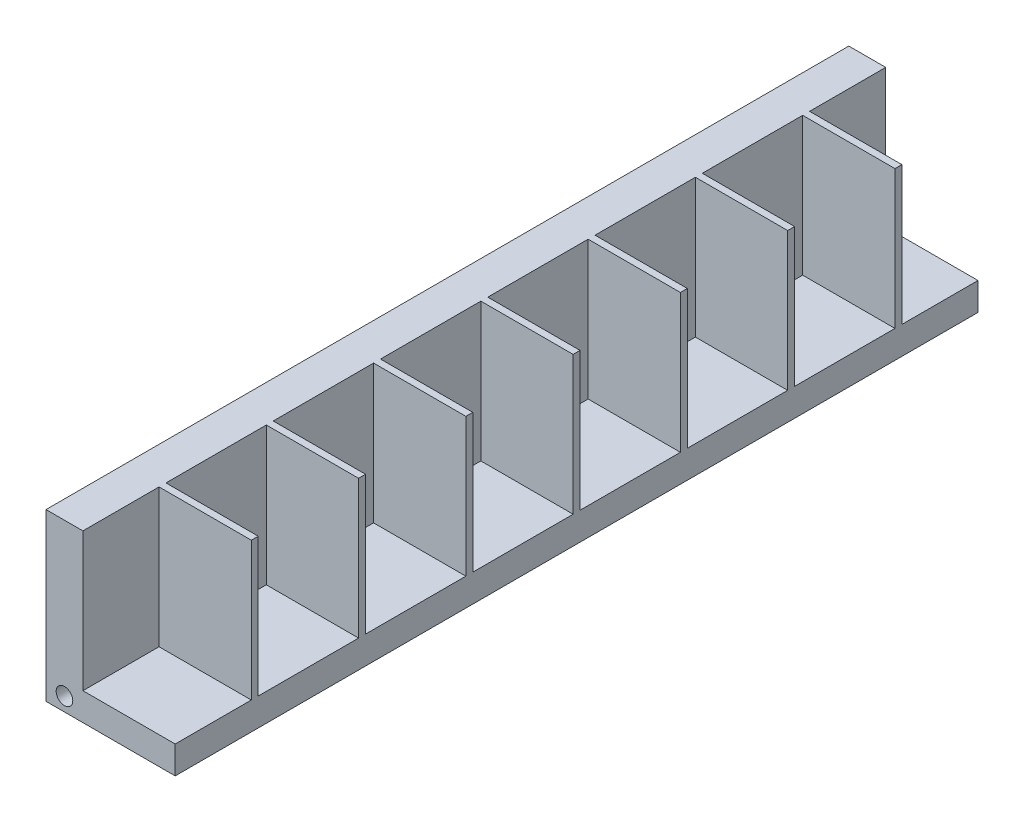
ISO-10303-21;
HEADER;
FILE_DESCRIPTION(('STEP AP214'),'2;1');
FILE_NAME('part.step','',(''),(''),'','','');
FILE_SCHEMA(('AUTOMOTIVE_DESIGN { 1 0 10303 214 1 1 1 1 }'));
ENDSEC;
DATA;
#1=APPLICATION_CONTEXT('core data for automotive mechanical design processes');
#2=APPLICATION_PROTOCOL_DEFINITION('international standard','automotive_design',2000,#1);
#3=PRODUCT_CONTEXT('',#1,'mechanical');
#4=PRODUCT('Part','Part','',(#3));
#5=PRODUCT_RELATED_PRODUCT_CATEGORY('part','',(#4));
#6=PRODUCT_DEFINITION_FORMATION('','',#4);
#7=PRODUCT_DEFINITION_CONTEXT('part definition',#1,'design');
#8=PRODUCT_DEFINITION('design','',#6,#7);
#9=PRODUCT_DEFINITION_SHAPE('','',#8);
#10=(LENGTH_UNIT() NAMED_UNIT(*) SI_UNIT(.MILLI.,.METRE.));
#11=(NAMED_UNIT(*) PLANE_ANGLE_UNIT() SI_UNIT($,.RADIAN.));
#12=(NAMED_UNIT(*) SI_UNIT($,.STERADIAN.) SOLID_ANGLE_UNIT());
#13=UNCERTAINTY_MEASURE_WITH_UNIT(LENGTH_MEASURE(1.E-05),#10,'distance_accuracy_value','');
#14=(GEOMETRIC_REPRESENTATION_CONTEXT(3) GLOBAL_UNCERTAINTY_ASSIGNED_CONTEXT((#13)) GLOBAL_UNIT_ASSIGNED_CONTEXT((#10,
#11,#12)) REPRESENTATION_CONTEXT('',''));
#15=CARTESIAN_POINT('',(0.,0.,0.));
#16=DIRECTION('',(0.,0.,1.));
#17=DIRECTION('',(1.,0.,0.));
#18=AXIS2_PLACEMENT_3D('',#15,#16,#17);
#19=CARTESIAN_POINT('',(-28.,-6.,-184.));
#20=DIRECTION('',(0.,-1.,0.));
#21=DIRECTION('',(0.,0.,-1.));
#22=AXIS2_PLACEMENT_3D('',#19,#20,#21);
#23=PLANE('',#22);
#24=DIRECTION('',(0.,0.,1.));
#25=VECTOR('',#24,1.);
#26=CARTESIAN_POINT('',(-28.,-6.,-184.));
#27=LINE('',#26,#25);
#28=CARTESIAN_POINT('',(-28.,-6.,-179.));
#29=VERTEX_POINT('',#28);
#30=CARTESIAN_POINT('',(-28.,-6.,-5.));
#31=VERTEX_POINT('',#30);
#32=EDGE_CURVE('E11',#29,#31,#27,.T.);
#33=ORIENTED_EDGE('',*,*,#32,.F.);
#34=DIRECTION('',(-1.,0.,0.));
#35=VECTOR('',#34,1.);
#36=CARTESIAN_POINT('',(-28.,-6.,-179.));
#37=LINE('',#36,#35);
#38=CARTESIAN_POINT('',(-4.82420696955816E-13,-6.,-179.));
#39=VERTEX_POINT('',#38);
#40=EDGE_CURVE('E264',#39,#29,#37,.T.);
#41=ORIENTED_EDGE('',*,*,#40,.F.);
#42=DIRECTION('',(0.,0.,1.));
#43=VECTOR('',#42,1.);
#44=CARTESIAN_POINT('',(0.,-6.,-184.));
#45=LINE('',#44,#43);
#46=CARTESIAN_POINT('',(0.,-6.,-5.));
#47=VERTEX_POINT('',#46);
#48=EDGE_CURVE('E292',#39,#47,#45,.T.);
#49=ORIENTED_EDGE('',*,*,#48,.T.);
#50=DIRECTION('',(1.,0.,0.));
#51=VECTOR('',#50,1.);
#52=CARTESIAN_POINT('',(-28.,-6.,-5.));
#53=LINE('',#52,#51);
#54=EDGE_CURVE('E303',#31,#47,#53,.T.);
#55=ORIENTED_EDGE('',*,*,#54,.F.);
#56=EDGE_LOOP('',(#33,#41,#49,#55));
#57=FACE_BOUND('',#56,.T.);
#58=ADVANCED_FACE('F39',(#57),#23,.T.);
#59=CARTESIAN_POINT('',(-28.,30.,-184.));
#60=DIRECTION('',(-1.,0.,0.));
#61=DIRECTION('',(0.,-1.,0.));
#62=AXIS2_PLACEMENT_3D('',#59,#60,#61);
#63=PLANE('',#62);
#64=DIRECTION('',(0.,0.,1.));
#65=VECTOR('',#64,1.);
#66=CARTESIAN_POINT('',(-28.,30.,-184.));
#67=LINE('',#66,#65);
#68=CARTESIAN_POINT('',(-28.,30.,-179.));
#69=VERTEX_POINT('',#68);
#70=CARTESIAN_POINT('',(-28.,30.,-5.));
#71=VERTEX_POINT('',#70);
#72=EDGE_CURVE('E47',#69,#71,#67,.T.);
#73=ORIENTED_EDGE('',*,*,#72,.F.);
#74=DIRECTION('',(0.,1.,0.));
#75=VECTOR('',#74,1.);
#76=CARTESIAN_POINT('',(-28.,-6.,-179.));
#77=LINE('',#76,#75);
#78=EDGE_CURVE('E259',#29,#69,#77,.T.);
#79=ORIENTED_EDGE('',*,*,#78,.F.);
#80=ORIENTED_EDGE('',*,*,#32,.T.);
#81=DIRECTION('',(0.,-1.,0.));
#82=VECTOR('',#81,1.);
#83=CARTESIAN_POINT('',(-28.,30.,-5.));
#84=LINE('',#83,#82);
#85=EDGE_CURVE('E281',#71,#31,#84,.T.);
#86=ORIENTED_EDGE('',*,*,#85,.F.);
#87=EDGE_LOOP('',(#73,#79,#80,#86));
#88=FACE_BOUND('',#87,.T.);
#89=ADVANCED_FACE('F279',(#88),#63,.T.);
#90=CARTESIAN_POINT('',(0.,30.,-184.));
#91=DIRECTION('',(0.,1.,0.));
#92=DIRECTION('',(-1.,0.,0.));
#93=AXIS2_PLACEMENT_3D('',#90,#91,#92);
#94=PLANE('',#93);
#95=DIRECTION('',(0.,0.,1.));
#96=VECTOR('',#95,1.);
#97=CARTESIAN_POINT('',(-20.0000000000006,30.,-162.75));
#98=LINE('',#97,#96);
#99=CARTESIAN_POINT('',(-20.0000000000006,30.,-179.));
#100=VERTEX_POINT('',#99);
#101=CARTESIAN_POINT('',(-20.0000000000005,30.,-162.5));
#102=VERTEX_POINT('',#101);
#103=EDGE_CURVE('E275',#100,#102,#98,.T.);
#104=ORIENTED_EDGE('',*,*,#103,.F.);
#105=DIRECTION('',(1.,0.,0.));
#106=VECTOR('',#105,1.);
#107=CARTESIAN_POINT('',(-28.,30.,-179.));
#108=LINE('',#107,#106);
#109=EDGE_CURVE('E262',#69,#100,#108,.T.);
#110=ORIENTED_EDGE('',*,*,#109,.F.);
#111=ORIENTED_EDGE('',*,*,#72,.T.);
#112=DIRECTION('',(-1.,0.,0.));
#113=VECTOR('',#112,1.);
#114=CARTESIAN_POINT('',(-28.,30.,-5.));
#115=LINE('',#114,#113);
#116=CARTESIAN_POINT('',(-20.,30.,-5.));
#117=VERTEX_POINT('',#116);
#118=EDGE_CURVE('E297',#117,#71,#115,.T.);
#119=ORIENTED_EDGE('',*,*,#118,.F.);
#120=DIRECTION('',(0.,0.,1.));
#121=VECTOR('',#120,1.);
#122=CARTESIAN_POINT('',(-20.,30.,0.));
#123=LINE('',#122,#121);
#124=CARTESIAN_POINT('',(-20.,30.,-21.5));
#125=VERTEX_POINT('',#124);
#126=EDGE_CURVE('E471',#125,#117,#123,.T.);
#127=ORIENTED_EDGE('',*,*,#126,.F.);
#128=DIRECTION('',(-1.,0.,0.));
#129=VECTOR('',#128,1.);
#130=CARTESIAN_POINT('',(-20.,30.,-21.5));
#131=LINE('',#130,#129);
#132=CARTESIAN_POINT('',(0.,30.,-21.5));
#133=VERTEX_POINT('',#132);
#134=EDGE_CURVE('E319',#133,#125,#131,.T.);
#135=ORIENTED_EDGE('',*,*,#134,.F.);
#136=DIRECTION('',(0.,0.,1.));
#137=VECTOR('',#136,1.);
#138=CARTESIAN_POINT('',(0.,30.,-184.));
#139=LINE('',#138,#137);
#140=CARTESIAN_POINT('',(0.,30.,-23.));
#141=VERTEX_POINT('',#140);
#142=EDGE_CURVE('E287',#141,#133,#139,.T.);
#143=ORIENTED_EDGE('',*,*,#142,.F.);
#144=DIRECTION('',(1.,0.,0.));
#145=VECTOR('',#144,1.);
#146=CARTESIAN_POINT('',(-20.,30.,-23.));
#147=LINE('',#146,#145);
#148=CARTESIAN_POINT('',(-20.,30.,-23.));
#149=VERTEX_POINT('',#148);
#150=EDGE_CURVE('E322',#149,#141,#147,.T.);
#151=ORIENTED_EDGE('',*,*,#150,.F.);
#152=DIRECTION('',(0.,0.,1.));
#153=VECTOR('',#152,1.);
#154=CARTESIAN_POINT('',(-20.0000000000001,30.,-23.25));
#155=LINE('',#154,#153);
#156=CARTESIAN_POINT('',(-20.0000000000001,30.,-44.75));
#157=VERTEX_POINT('',#156);
#158=EDGE_CURVE('E476',#157,#149,#155,.T.);
#159=ORIENTED_EDGE('',*,*,#158,.F.);
#160=DIRECTION('',(-1.,0.,0.));
#161=VECTOR('',#160,1.);
#162=CARTESIAN_POINT('',(-20.0000000000001,30.,-44.75));
#163=LINE('',#162,#161);
#164=CARTESIAN_POINT('',(0.,30.,-44.75));
#165=VERTEX_POINT('',#164);
#166=EDGE_CURVE('E335',#165,#157,#163,.T.);
#167=ORIENTED_EDGE('',*,*,#166,.F.);
#168=CARTESIAN_POINT('',(0.,30.,-46.25));
#169=VERTEX_POINT('',#168);
#170=EDGE_CURVE('E291',#169,#165,#139,.T.);
#171=ORIENTED_EDGE('',*,*,#170,.F.);
#172=DIRECTION('',(1.,0.,0.));
#173=VECTOR('',#172,1.);
#174=CARTESIAN_POINT('',(-20.0000000000001,30.,-46.25));
#175=LINE('',#174,#173);
#176=CARTESIAN_POINT('',(-20.0000000000001,30.,-46.25));
#177=VERTEX_POINT('',#176);
#178=EDGE_CURVE('E345',#177,#169,#175,.T.);
#179=ORIENTED_EDGE('',*,*,#178,.F.);
#180=DIRECTION('',(0.,0.,1.));
#181=VECTOR('',#180,1.);
#182=CARTESIAN_POINT('',(-20.0000000000002,30.,-46.5));
#183=LINE('',#182,#181);
#184=CARTESIAN_POINT('',(-20.0000000000002,30.,-68.));
#185=VERTEX_POINT('',#184);
#186=EDGE_CURVE('E481',#185,#177,#183,.T.);
#187=ORIENTED_EDGE('',*,*,#186,.F.);
#188=DIRECTION('',(-1.,0.,0.));
#189=VECTOR('',#188,1.);
#190=CARTESIAN_POINT('',(-20.0000000000002,30.,-68.));
#191=LINE('',#190,#189);
#192=CARTESIAN_POINT('',(-1.63223843039567E-13,30.,-68.));
#193=VERTEX_POINT('',#192);
#194=EDGE_CURVE('E357',#193,#185,#191,.T.);
#195=ORIENTED_EDGE('',*,*,#194,.F.);
#196=CARTESIAN_POINT('',(-1.63407540059439E-13,30.,-69.5));
#197=VERTEX_POINT('',#196);
#198=EDGE_CURVE('E553',#197,#193,#139,.T.);
#199=ORIENTED_EDGE('',*,*,#198,.F.);
#200=DIRECTION('',(1.,0.,0.));
#201=VECTOR('',#200,1.);
#202=CARTESIAN_POINT('',(-20.0000000000002,30.,-69.5));
#203=LINE('',#202,#201);
#204=CARTESIAN_POINT('',(-20.0000000000002,30.,-69.5));
#205=VERTEX_POINT('',#204);
#206=EDGE_CURVE('E367',#205,#197,#203,.T.);
#207=ORIENTED_EDGE('',*,*,#206,.F.);
#208=DIRECTION('',(0.,0.,1.));
#209=VECTOR('',#208,1.);
#210=CARTESIAN_POINT('',(-20.0000000000002,30.,-69.75));
#211=LINE('',#210,#209);
#212=CARTESIAN_POINT('',(-20.0000000000002,30.,-91.25));
#213=VERTEX_POINT('',#212);
#214=EDGE_CURVE('E487',#213,#205,#211,.T.);
#215=ORIENTED_EDGE('',*,*,#214,.F.);
#216=DIRECTION('',(-1.,0.,0.));
#217=VECTOR('',#216,1.);
#218=CARTESIAN_POINT('',(-20.0000000000002,30.,-91.25));
#219=LINE('',#218,#217);
#220=CARTESIAN_POINT('',(-2.42977132263661E-13,30.,-91.25));
#221=VERTEX_POINT('',#220);
#222=EDGE_CURVE('E379',#221,#213,#219,.T.);
#223=ORIENTED_EDGE('',*,*,#222,.F.);
#224=CARTESIAN_POINT('',(-2.43160829283533E-13,30.,-92.75));
#225=VERTEX_POINT('',#224);
#226=EDGE_CURVE('E549',#225,#221,#139,.T.);
#227=ORIENTED_EDGE('',*,*,#226,.F.);
#228=DIRECTION('',(1.,0.,0.));
#229=VECTOR('',#228,1.);
#230=CARTESIAN_POINT('',(-20.0000000000002,30.,-92.75));
#231=LINE('',#230,#229);
#232=CARTESIAN_POINT('',(-20.0000000000002,30.,-92.75));
#233=VERTEX_POINT('',#232);
#234=EDGE_CURVE('E389',#233,#225,#231,.T.);
#235=ORIENTED_EDGE('',*,*,#234,.F.);
#236=DIRECTION('',(0.,0.,1.));
#237=VECTOR('',#236,1.);
#238=CARTESIAN_POINT('',(-20.0000000000003,30.,-93.));
#239=LINE('',#238,#237);
#240=CARTESIAN_POINT('',(-20.0000000000003,30.,-114.5));
#241=VERTEX_POINT('',#240);
#242=EDGE_CURVE('E493',#241,#233,#239,.T.);
#243=ORIENTED_EDGE('',*,*,#242,.F.);
#244=DIRECTION('',(-1.,0.,0.));
#245=VECTOR('',#244,1.);
#246=CARTESIAN_POINT('',(-20.0000000000003,30.,-114.5));
#247=LINE('',#246,#245);
#248=CARTESIAN_POINT('',(-3.22730421487755E-13,30.,-114.5));
#249=VERTEX_POINT('',#248);
#250=EDGE_CURVE('E401',#249,#241,#247,.T.);
#251=ORIENTED_EDGE('',*,*,#250,.F.);
#252=CARTESIAN_POINT('',(-3.22914118507627E-13,30.,-116.));
#253=VERTEX_POINT('',#252);
#254=EDGE_CURVE('E547',#253,#249,#139,.T.);
#255=ORIENTED_EDGE('',*,*,#254,.F.);
#256=DIRECTION('',(1.,0.,0.));
#257=VECTOR('',#256,1.);
#258=CARTESIAN_POINT('',(-20.0000000000003,30.,-116.));
#259=LINE('',#258,#257);
#260=CARTESIAN_POINT('',(-20.0000000000003,30.,-116.));
#261=VERTEX_POINT('',#260);
#262=EDGE_CURVE('E411',#261,#253,#259,.T.);
#263=ORIENTED_EDGE('',*,*,#262,.F.);
#264=DIRECTION('',(0.,0.,1.));
#265=VECTOR('',#264,1.);
#266=CARTESIAN_POINT('',(-20.0000000000004,30.,-116.25));
#267=LINE('',#266,#265);
#268=CARTESIAN_POINT('',(-20.0000000000004,30.,-137.75));
#269=VERTEX_POINT('',#268);
#270=EDGE_CURVE('E499',#269,#261,#267,.T.);
#271=ORIENTED_EDGE('',*,*,#270,.F.);
#272=DIRECTION('',(-1.,0.,0.));
#273=VECTOR('',#272,1.);
#274=CARTESIAN_POINT('',(-20.0000000000004,30.,-137.75));
#275=LINE('',#274,#273);
#276=CARTESIAN_POINT('',(-4.02483710711849E-13,30.,-137.75));
#277=VERTEX_POINT('',#276);
#278=EDGE_CURVE('E423',#277,#269,#275,.T.);
#279=ORIENTED_EDGE('',*,*,#278,.F.);
#280=CARTESIAN_POINT('',(-4.02667407731721E-13,30.,-139.25));
#281=VERTEX_POINT('',#280);
#282=EDGE_CURVE('E285',#281,#277,#139,.T.);
#283=ORIENTED_EDGE('',*,*,#282,.F.);
#284=DIRECTION('',(1.,0.,0.));
#285=VECTOR('',#284,1.);
#286=CARTESIAN_POINT('',(-20.0000000000004,30.,-139.25));
#287=LINE('',#286,#285);
#288=CARTESIAN_POINT('',(-20.0000000000004,30.,-139.25));
#289=VERTEX_POINT('',#288);
#290=EDGE_CURVE('E433',#289,#281,#287,.T.);
#291=ORIENTED_EDGE('',*,*,#290,.F.);
#292=DIRECTION('',(0.,0.,1.));
#293=VECTOR('',#292,1.);
#294=CARTESIAN_POINT('',(-20.0000000000005,30.,-139.5));
#295=LINE('',#294,#293);
#296=CARTESIAN_POINT('',(-20.0000000000005,30.,-161.));
#297=VERTEX_POINT('',#296);
#298=EDGE_CURVE('E505',#297,#289,#295,.T.);
#299=ORIENTED_EDGE('',*,*,#298,.F.);
#300=DIRECTION('',(-1.,0.,0.));
#301=VECTOR('',#300,1.);
#302=CARTESIAN_POINT('',(-20.0000000000005,30.,-161.));
#303=LINE('',#302,#301);
#304=CARTESIAN_POINT('',(-4.82236999935943E-13,30.,-161.));
#305=VERTEX_POINT('',#304);
#306=EDGE_CURVE('E445',#305,#297,#303,.T.);
#307=ORIENTED_EDGE('',*,*,#306,.F.);
#308=CARTESIAN_POINT('',(-4.82420696955816E-13,30.,-162.5));
#309=VERTEX_POINT('',#308);
#310=EDGE_CURVE('E282',#309,#305,#139,.T.);
#311=ORIENTED_EDGE('',*,*,#310,.F.);
#312=DIRECTION('',(1.,0.,0.));
#313=VECTOR('',#312,1.);
#314=CARTESIAN_POINT('',(-20.0000000000005,30.,-162.5));
#315=LINE('',#314,#313);
#316=EDGE_CURVE('E455',#102,#309,#315,.T.);
#317=ORIENTED_EDGE('',*,*,#316,.F.);
#318=EDGE_LOOP('',(#104,#110,#111,#119,#127,#135,#143,#151,#159,#167,#171,#179,#187,#195,#199,
#207,#215,#223,#227,#235,#243,#251,#255,#263,#271,#279,#283,#291,#299,#307,#311,#317));
#319=FACE_BOUND('',#318,.T.);
#320=ADVANCED_FACE('F271',(#319),#94,.T.);
#321=CARTESIAN_POINT('',(0.,0.,-184.));
#322=DIRECTION('',(1.,0.,0.));
#323=DIRECTION('',(0.,0.,-1.));
#324=AXIS2_PLACEMENT_3D('',#321,#322,#323);
#325=PLANE('',#324);
#326=ORIENTED_EDGE('',*,*,#48,.F.);
#327=DIRECTION('',(0.,-1.,0.));
#328=VECTOR('',#327,1.);
#329=CARTESIAN_POINT('',(-4.82420696955816E-13,-6.,-179.));
#330=LINE('',#329,#328);
#331=CARTESIAN_POINT('',(-4.82420696955816E-13,0.,-179.));
#332=VERTEX_POINT('',#331);
#333=EDGE_CURVE('E276',#332,#39,#330,.T.);
#334=ORIENTED_EDGE('',*,*,#333,.F.);
#335=DIRECTION('',(0.,0.,-1.));
#336=VECTOR('',#335,1.);
#337=CARTESIAN_POINT('',(-5.62298223855911E-13,0.,-162.75));
#338=LINE('',#337,#336);
#339=CARTESIAN_POINT('',(-4.82420696955816E-13,0.,-162.5));
#340=VERTEX_POINT('',#339);
#341=EDGE_CURVE('E513',#340,#332,#338,.T.);
#342=ORIENTED_EDGE('',*,*,#341,.F.);
#343=DIRECTION('',(0.,1.,0.));
#344=VECTOR('',#343,1.);
#345=CARTESIAN_POINT('',(-4.82420696955816E-13,0.,-162.5));
#346=LINE('',#345,#344);
#347=EDGE_CURVE('E314',#340,#309,#346,.T.);
#348=ORIENTED_EDGE('',*,*,#347,.T.);
#349=ORIENTED_EDGE('',*,*,#310,.T.);
#350=DIRECTION('',(0.,1.,0.));
#351=VECTOR('',#350,1.);
#352=CARTESIAN_POINT('',(-4.82236999935943E-13,0.,-161.));
#353=LINE('',#352,#351);
#354=CARTESIAN_POINT('',(-4.82236999935943E-13,0.,-161.));
#355=VERTEX_POINT('',#354);
#356=EDGE_CURVE('E449',#355,#305,#353,.T.);
#357=ORIENTED_EDGE('',*,*,#356,.F.);
#358=DIRECTION('',(0.,0.,-1.));
#359=VECTOR('',#358,1.);
#360=CARTESIAN_POINT('',(-4.82500943960978E-13,0.,-139.5));
#361=LINE('',#360,#359);
#362=CARTESIAN_POINT('',(-4.02667407731721E-13,0.,-139.25));
#363=VERTEX_POINT('',#362);
#364=EDGE_CURVE('E508',#363,#355,#361,.T.);
#365=ORIENTED_EDGE('',*,*,#364,.F.);
#366=DIRECTION('',(0.,1.,0.));
#367=VECTOR('',#366,1.);
#368=CARTESIAN_POINT('',(-4.02667407731721E-13,0.,-139.25));
#369=LINE('',#368,#367);
#370=EDGE_CURVE('E442',#363,#281,#369,.T.);
#371=ORIENTED_EDGE('',*,*,#370,.T.);
#372=ORIENTED_EDGE('',*,*,#282,.T.);
#373=DIRECTION('',(0.,1.,0.));
#374=VECTOR('',#373,1.);
#375=CARTESIAN_POINT('',(-4.02483710711849E-13,0.,-137.75));
#376=LINE('',#375,#374);
#377=CARTESIAN_POINT('',(-4.02483710711849E-13,0.,-137.75));
#378=VERTEX_POINT('',#377);
#379=EDGE_CURVE('E427',#378,#277,#376,.T.);
#380=ORIENTED_EDGE('',*,*,#379,.F.);
#381=DIRECTION('',(0.,0.,-1.));
#382=VECTOR('',#381,1.);
#383=CARTESIAN_POINT('',(-4.02703664066044E-13,0.,-116.25));
#384=LINE('',#383,#382);
#385=CARTESIAN_POINT('',(-3.22914118507627E-13,0.,-116.));
#386=VERTEX_POINT('',#385);
#387=EDGE_CURVE('E502',#386,#378,#384,.T.);
#388=ORIENTED_EDGE('',*,*,#387,.F.);
#389=DIRECTION('',(0.,1.,0.));
#390=VECTOR('',#389,1.);
#391=CARTESIAN_POINT('',(-3.22914118507627E-13,0.,-116.));
#392=LINE('',#391,#390);
#393=EDGE_CURVE('E420',#386,#253,#392,.T.);
#394=ORIENTED_EDGE('',*,*,#393,.T.);
#395=ORIENTED_EDGE('',*,*,#254,.T.);
#396=DIRECTION('',(0.,1.,0.));
#397=VECTOR('',#396,1.);
#398=CARTESIAN_POINT('',(-3.22730421487755E-13,0.,-114.5));
#399=LINE('',#398,#397);
#400=CARTESIAN_POINT('',(-3.22730421487755E-13,0.,-114.5));
#401=VERTEX_POINT('',#400);
#402=EDGE_CURVE('E405',#401,#249,#399,.T.);
#403=ORIENTED_EDGE('',*,*,#402,.F.);
#404=DIRECTION('',(0.,0.,-1.));
#405=VECTOR('',#404,1.);
#406=CARTESIAN_POINT('',(-3.22906384171111E-13,0.,-93.));
#407=LINE('',#406,#405);
#408=CARTESIAN_POINT('',(-2.43160829283533E-13,0.,-92.75));
#409=VERTEX_POINT('',#408);
#410=EDGE_CURVE('E496',#409,#401,#407,.T.);
#411=ORIENTED_EDGE('',*,*,#410,.F.);
#412=DIRECTION('',(0.,1.,0.));
#413=VECTOR('',#412,1.);
#414=CARTESIAN_POINT('',(-2.43160829283533E-13,0.,-92.75));
#415=LINE('',#414,#413);
#416=EDGE_CURVE('E398',#409,#225,#415,.T.);
#417=ORIENTED_EDGE('',*,*,#416,.T.);
#418=ORIENTED_EDGE('',*,*,#226,.T.);
#419=DIRECTION('',(0.,1.,0.));
#420=VECTOR('',#419,1.);
#421=CARTESIAN_POINT('',(-2.42977132263661E-13,0.,-91.25));
#422=LINE('',#421,#420);
#423=CARTESIAN_POINT('',(-2.42977132263661E-13,0.,-91.25));
#424=VERTEX_POINT('',#423);
#425=EDGE_CURVE('E383',#424,#221,#422,.T.);
#426=ORIENTED_EDGE('',*,*,#425,.F.);
#427=DIRECTION('',(0.,0.,-1.));
#428=VECTOR('',#427,1.);
#429=CARTESIAN_POINT('',(-2.43109104276178E-13,0.,-69.75));
#430=LINE('',#429,#428);
#431=CARTESIAN_POINT('',(-1.63407540059439E-13,0.,-69.5));
#432=VERTEX_POINT('',#431);
#433=EDGE_CURVE('E490',#432,#424,#430,.T.);
#434=ORIENTED_EDGE('',*,*,#433,.F.);
#435=DIRECTION('',(0.,1.,0.));
#436=VECTOR('',#435,1.);
#437=CARTESIAN_POINT('',(-1.63407540059439E-13,0.,-69.5));
#438=LINE('',#437,#436);
#439=EDGE_CURVE('E376',#432,#197,#438,.T.);
#440=ORIENTED_EDGE('',*,*,#439,.T.);
#441=ORIENTED_EDGE('',*,*,#198,.T.);
#442=DIRECTION('',(0.,1.,0.));
#443=VECTOR('',#442,1.);
#444=CARTESIAN_POINT('',(-1.63223843039567E-13,0.,-68.));
#445=LINE('',#444,#443);
#446=CARTESIAN_POINT('',(-1.63223843039567E-13,0.,-68.));
#447=VERTEX_POINT('',#446);
#448=EDGE_CURVE('E361',#447,#193,#445,.T.);
#449=ORIENTED_EDGE('',*,*,#448,.F.);
#450=DIRECTION('',(0.,0.,-1.));
#451=VECTOR('',#450,1.);
#452=CARTESIAN_POINT('',(-1.63311824381245E-13,0.,-46.5));
#453=LINE('',#452,#451);
#454=CARTESIAN_POINT('',(0.,0.,-46.25));
#455=VERTEX_POINT('',#454);
#456=EDGE_CURVE('E484',#455,#447,#453,.T.);
#457=ORIENTED_EDGE('',*,*,#456,.F.);
#458=DIRECTION('',(0.,1.,0.));
#459=VECTOR('',#458,1.);
#460=CARTESIAN_POINT('',(0.,0.,-46.25));
#461=LINE('',#460,#459);
#462=EDGE_CURVE('E354',#455,#169,#461,.T.);
#463=ORIENTED_EDGE('',*,*,#462,.T.);
#464=ORIENTED_EDGE('',*,*,#170,.T.);
#465=DIRECTION('',(0.,1.,0.));
#466=VECTOR('',#465,1.);
#467=CARTESIAN_POINT('',(0.,0.,-44.75));
#468=LINE('',#467,#466);
#469=CARTESIAN_POINT('',(0.,0.,-44.75));
#470=VERTEX_POINT('',#469);
#471=EDGE_CURVE('E339',#470,#165,#468,.T.);
#472=ORIENTED_EDGE('',*,*,#471,.F.);
#473=DIRECTION('',(0.,0.,-1.));
#474=VECTOR('',#473,1.);
#475=CARTESIAN_POINT('',(0.,0.,-23.25));
#476=LINE('',#475,#474);
#477=CARTESIAN_POINT('',(0.,0.,-23.));
#478=VERTEX_POINT('',#477);
#479=EDGE_CURVE('E478',#478,#470,#476,.T.);
#480=ORIENTED_EDGE('',*,*,#479,.F.);
#481=DIRECTION('',(0.,1.,0.));
#482=VECTOR('',#481,1.);
#483=CARTESIAN_POINT('',(0.,0.,-23.));
#484=LINE('',#483,#482);
#485=EDGE_CURVE('E332',#478,#141,#484,.T.);
#486=ORIENTED_EDGE('',*,*,#485,.T.);
#487=ORIENTED_EDGE('',*,*,#142,.T.);
#488=DIRECTION('',(0.,1.,0.));
#489=VECTOR('',#488,1.);
#490=CARTESIAN_POINT('',(0.,0.,-21.5));
#491=LINE('',#490,#489);
#492=CARTESIAN_POINT('',(0.,0.,-21.5));
#493=VERTEX_POINT('',#492);
#494=EDGE_CURVE('E318',#493,#133,#491,.T.);
#495=ORIENTED_EDGE('',*,*,#494,.F.);
#496=DIRECTION('',(0.,0.,-1.));
#497=VECTOR('',#496,1.);
#498=CARTESIAN_POINT('',(0.,0.,0.));
#499=LINE('',#498,#497);
#500=CARTESIAN_POINT('',(0.,0.,-5.));
#501=VERTEX_POINT('',#500);
#502=EDGE_CURVE('E469',#501,#493,#499,.T.);
#503=ORIENTED_EDGE('',*,*,#502,.F.);
#504=DIRECTION('',(0.,1.,0.));
#505=VECTOR('',#504,1.);
#506=CARTESIAN_POINT('',(0.,30.,-5.));
#507=LINE('',#506,#505);
#508=EDGE_CURVE('E63',#47,#501,#507,.T.);
#509=ORIENTED_EDGE('',*,*,#508,.F.);
#510=EDGE_LOOP('',(#326,#334,#342,#348,#349,#357,#365,#371,#372,#380,#388,#394,#395,#403,#411,
#417,#418,#426,#434,#440,#441,#449,#457,#463,#464,#472,#480,#486,#487,#495,#503,#509));
#511=FACE_BOUND('',#510,.T.);
#512=ADVANCED_FACE('F524',(#511),#325,.T.);
#513=CARTESIAN_POINT('',(-20.0000000000006,0.,-162.75));
#514=DIRECTION('',(-1.,0.,0.));
#515=DIRECTION('',(0.,0.,1.));
#516=AXIS2_PLACEMENT_3D('',#513,#514,#515);
#517=PLANE('',#516);
#518=DIRECTION('',(0.,-1.,0.));
#519=VECTOR('',#518,1.);
#520=CARTESIAN_POINT('',(-20.0000000000006,0.,-179.));
#521=LINE('',#520,#519);
#522=CARTESIAN_POINT('',(-20.0000000000006,0.,-179.));
#523=VERTEX_POINT('',#522);
#524=EDGE_CURVE('E55',#100,#523,#521,.T.);
#525=ORIENTED_EDGE('',*,*,#524,.F.);
#526=ORIENTED_EDGE('',*,*,#103,.T.);
#527=DIRECTION('',(0.,1.,0.));
#528=VECTOR('',#527,1.);
#529=CARTESIAN_POINT('',(-20.0000000000005,0.,-162.5));
#530=LINE('',#529,#528);
#531=CARTESIAN_POINT('',(-20.0000000000005,0.,-162.5));
#532=VERTEX_POINT('',#531);
#533=EDGE_CURVE('E460',#532,#102,#530,.T.);
#534=ORIENTED_EDGE('',*,*,#533,.F.);
#535=DIRECTION('',(0.,0.,1.));
#536=VECTOR('',#535,1.);
#537=CARTESIAN_POINT('',(-20.0000000000006,0.,-162.75));
#538=LINE('',#537,#536);
#539=EDGE_CURVE('E326',#523,#532,#538,.T.);
#540=ORIENTED_EDGE('',*,*,#539,.F.);
#541=EDGE_LOOP('',(#525,#526,#534,#540));
#542=FACE_BOUND('',#541,.T.);
#543=ADVANCED_FACE('F600',(#542),#517,.F.);
#544=CARTESIAN_POINT('',(0.,0.,0.));
#545=DIRECTION('',(0.,-1.,0.));
#546=DIRECTION('',(0.,0.,-1.));
#547=AXIS2_PLACEMENT_3D('',#544,#545,#546);
#548=PLANE('',#547);
#549=DIRECTION('',(1.,0.,0.));
#550=VECTOR('',#549,1.);
#551=CARTESIAN_POINT('',(0.,0.,-179.));
#552=LINE('',#551,#550);
#553=EDGE_CURVE('E517',#523,#332,#552,.T.);
#554=ORIENTED_EDGE('',*,*,#553,.F.);
#555=ORIENTED_EDGE('',*,*,#539,.T.);
#556=DIRECTION('',(1.,0.,0.));
#557=VECTOR('',#556,1.);
#558=CARTESIAN_POINT('',(-20.0000000000005,0.,-162.5));
#559=LINE('',#558,#557);
#560=EDGE_CURVE('E463',#532,#340,#559,.T.);
#561=ORIENTED_EDGE('',*,*,#560,.T.);
#562=ORIENTED_EDGE('',*,*,#341,.T.);
#563=EDGE_LOOP('',(#554,#555,#561,#562));
#564=FACE_BOUND('',#563,.T.);
#565=ADVANCED_FACE('F516',(#564),#548,.F.);
#566=CARTESIAN_POINT('',(-20.,0.,0.));
#567=DIRECTION('',(-1.,0.,0.));
#568=DIRECTION('',(0.,0.,1.));
#569=AXIS2_PLACEMENT_3D('',#566,#567,#568);
#570=PLANE('',#569);
#571=DIRECTION('',(0.,1.,0.));
#572=VECTOR('',#571,1.);
#573=CARTESIAN_POINT('',(-20.,0.,-5.));
#574=LINE('',#573,#572);
#575=CARTESIAN_POINT('',(-20.,0.,-5.));
#576=VERTEX_POINT('',#575);
#577=EDGE_CURVE('E300',#576,#117,#574,.T.);
#578=ORIENTED_EDGE('',*,*,#577,.F.);
#579=DIRECTION('',(0.,0.,1.));
#580=VECTOR('',#579,1.);
#581=CARTESIAN_POINT('',(-20.,0.,0.));
#582=LINE('',#581,#580);
#583=CARTESIAN_POINT('',(-20.,0.,-21.5));
#584=VERTEX_POINT('',#583);
#585=EDGE_CURVE('E293',#584,#576,#582,.T.);
#586=ORIENTED_EDGE('',*,*,#585,.F.);
#587=DIRECTION('',(0.,1.,0.));
#588=VECTOR('',#587,1.);
#589=CARTESIAN_POINT('',(-20.,0.,-21.5));
#590=LINE('',#589,#588);
#591=EDGE_CURVE('E323',#584,#125,#590,.T.);
#592=ORIENTED_EDGE('',*,*,#591,.T.);
#593=ORIENTED_EDGE('',*,*,#126,.T.);
#594=EDGE_LOOP('',(#578,#586,#592,#593));
#595=FACE_BOUND('',#594,.T.);
#596=ADVANCED_FACE('F590',(#595),#570,.F.);
#597=CARTESIAN_POINT('',(0.,0.,0.));
#598=DIRECTION('',(0.,1.,0.));
#599=DIRECTION('',(0.,0.,1.));
#600=AXIS2_PLACEMENT_3D('',#597,#598,#599);
#601=PLANE('',#600);
#602=ORIENTED_EDGE('',*,*,#585,.T.);
#603=DIRECTION('',(1.,0.,0.));
#604=VECTOR('',#603,1.);
#605=CARTESIAN_POINT('',(0.,0.,-5.));
#606=LINE('',#605,#604);
#607=EDGE_CURVE('E296',#576,#501,#606,.T.);
#608=ORIENTED_EDGE('',*,*,#607,.T.);
#609=ORIENTED_EDGE('',*,*,#502,.T.);
#610=DIRECTION('',(-1.,0.,0.));
#611=VECTOR('',#610,1.);
#612=CARTESIAN_POINT('',(-20.,0.,-21.5));
#613=LINE('',#612,#611);
#614=EDGE_CURVE('E315',#493,#584,#613,.T.);
#615=ORIENTED_EDGE('',*,*,#614,.T.);
#616=EDGE_LOOP('',(#602,#608,#609,#615));
#617=FACE_BOUND('',#616,.T.);
#618=ADVANCED_FACE('F586',(#617),#601,.T.);
#619=CARTESIAN_POINT('',(-20.0000000000005,0.,-139.5));
#620=DIRECTION('',(-1.,0.,0.));
#621=DIRECTION('',(0.,0.,1.));
#622=AXIS2_PLACEMENT_3D('',#619,#620,#621);
#623=PLANE('',#622);
#624=ORIENTED_EDGE('',*,*,#298,.T.);
#625=DIRECTION('',(0.,1.,0.));
#626=VECTOR('',#625,1.);
#627=CARTESIAN_POINT('',(-20.0000000000004,0.,-139.25));
#628=LINE('',#627,#626);
#629=CARTESIAN_POINT('',(-20.0000000000004,0.,-139.25));
#630=VERTEX_POINT('',#629);
#631=EDGE_CURVE('E438',#630,#289,#628,.T.);
#632=ORIENTED_EDGE('',*,*,#631,.F.);
#633=DIRECTION('',(0.,0.,1.));
#634=VECTOR('',#633,1.);
#635=CARTESIAN_POINT('',(-20.0000000000005,0.,-139.5));
#636=LINE('',#635,#634);
#637=CARTESIAN_POINT('',(-20.0000000000005,0.,-161.));
#638=VERTEX_POINT('',#637);
#639=EDGE_CURVE('E509',#638,#630,#636,.T.);
#640=ORIENTED_EDGE('',*,*,#639,.F.);
#641=DIRECTION('',(0.,1.,0.));
#642=VECTOR('',#641,1.);
#643=CARTESIAN_POINT('',(-20.0000000000005,0.,-161.));
#644=LINE('',#643,#642);
#645=EDGE_CURVE('E452',#638,#297,#644,.T.);
#646=ORIENTED_EDGE('',*,*,#645,.T.);
#647=EDGE_LOOP('',(#624,#632,#640,#646));
#648=FACE_BOUND('',#647,.T.);
#649=ADVANCED_FACE('F597',(#648),#623,.F.);
#650=CARTESIAN_POINT('',(0.,0.,0.));
#651=DIRECTION('',(0.,-1.,0.));
#652=DIRECTION('',(0.,0.,-1.));
#653=AXIS2_PLACEMENT_3D('',#650,#651,#652);
#654=PLANE('',#653);
#655=ORIENTED_EDGE('',*,*,#639,.T.);
#656=DIRECTION('',(1.,0.,0.));
#657=VECTOR('',#656,1.);
#658=CARTESIAN_POINT('',(-20.0000000000004,0.,-139.25));
#659=LINE('',#658,#657);
#660=EDGE_CURVE('E441',#630,#363,#659,.T.);
#661=ORIENTED_EDGE('',*,*,#660,.T.);
#662=ORIENTED_EDGE('',*,*,#364,.T.);
#663=DIRECTION('',(-1.,0.,0.));
#664=VECTOR('',#663,1.);
#665=CARTESIAN_POINT('',(-20.0000000000005,0.,-161.));
#666=LINE('',#665,#664);
#667=EDGE_CURVE('E451',#355,#638,#666,.T.);
#668=ORIENTED_EDGE('',*,*,#667,.T.);
#669=EDGE_LOOP('',(#655,#661,#662,#668));
#670=FACE_BOUND('',#669,.T.);
#671=ADVANCED_FACE('F537',(#670),#654,.F.);
#672=CARTESIAN_POINT('',(-20.0000000000004,0.,-116.25));
#673=DIRECTION('',(-1.,0.,0.));
#674=DIRECTION('',(0.,0.,1.));
#675=AXIS2_PLACEMENT_3D('',#672,#673,#674);
#676=PLANE('',#675);
#677=ORIENTED_EDGE('',*,*,#270,.T.);
#678=DIRECTION('',(0.,1.,0.));
#679=VECTOR('',#678,1.);
#680=CARTESIAN_POINT('',(-20.0000000000003,0.,-116.));
#681=LINE('',#680,#679);
#682=CARTESIAN_POINT('',(-20.0000000000003,0.,-116.));
#683=VERTEX_POINT('',#682);
#684=EDGE_CURVE('E416',#683,#261,#681,.T.);
#685=ORIENTED_EDGE('',*,*,#684,.F.);
#686=DIRECTION('',(0.,0.,1.));
#687=VECTOR('',#686,1.);
#688=CARTESIAN_POINT('',(-20.0000000000004,0.,-116.25));
#689=LINE('',#688,#687);
#690=CARTESIAN_POINT('',(-20.0000000000004,0.,-137.75));
#691=VERTEX_POINT('',#690);
#692=EDGE_CURVE('E503',#691,#683,#689,.T.);
#693=ORIENTED_EDGE('',*,*,#692,.F.);
#694=DIRECTION('',(0.,1.,0.));
#695=VECTOR('',#694,1.);
#696=CARTESIAN_POINT('',(-20.0000000000004,0.,-137.75));
#697=LINE('',#696,#695);
#698=EDGE_CURVE('E430',#691,#269,#697,.T.);
#699=ORIENTED_EDGE('',*,*,#698,.T.);
#700=EDGE_LOOP('',(#677,#685,#693,#699));
#701=FACE_BOUND('',#700,.T.);
#702=ADVANCED_FACE('F985',(#701),#676,.F.);
#703=CARTESIAN_POINT('',(0.,0.,0.));
#704=DIRECTION('',(0.,-1.,0.));
#705=DIRECTION('',(0.,0.,-1.));
#706=AXIS2_PLACEMENT_3D('',#703,#704,#705);
#707=PLANE('',#706);
#708=ORIENTED_EDGE('',*,*,#692,.T.);
#709=DIRECTION('',(1.,0.,0.));
#710=VECTOR('',#709,1.);
#711=CARTESIAN_POINT('',(-20.0000000000003,0.,-116.));
#712=LINE('',#711,#710);
#713=EDGE_CURVE('E419',#683,#386,#712,.T.);
#714=ORIENTED_EDGE('',*,*,#713,.T.);
#715=ORIENTED_EDGE('',*,*,#387,.T.);
#716=DIRECTION('',(-1.,0.,0.));
#717=VECTOR('',#716,1.);
#718=CARTESIAN_POINT('',(-20.0000000000004,0.,-137.75));
#719=LINE('',#718,#717);
#720=EDGE_CURVE('E429',#378,#691,#719,.T.);
#721=ORIENTED_EDGE('',*,*,#720,.T.);
#722=EDGE_LOOP('',(#708,#714,#715,#721));
#723=FACE_BOUND('',#722,.T.);
#724=ADVANCED_FACE('F975',(#723),#707,.F.);
#725=CARTESIAN_POINT('',(-20.0000000000003,0.,-93.));
#726=DIRECTION('',(-1.,0.,0.));
#727=DIRECTION('',(0.,0.,1.));
#728=AXIS2_PLACEMENT_3D('',#725,#726,#727);
#729=PLANE('',#728);
#730=ORIENTED_EDGE('',*,*,#242,.T.);
#731=DIRECTION('',(0.,1.,0.));
#732=VECTOR('',#731,1.);
#733=CARTESIAN_POINT('',(-20.0000000000002,0.,-92.75));
#734=LINE('',#733,#732);
#735=CARTESIAN_POINT('',(-20.0000000000002,0.,-92.75));
#736=VERTEX_POINT('',#735);
#737=EDGE_CURVE('E394',#736,#233,#734,.T.);
#738=ORIENTED_EDGE('',*,*,#737,.F.);
#739=DIRECTION('',(0.,0.,1.));
#740=VECTOR('',#739,1.);
#741=CARTESIAN_POINT('',(-20.0000000000003,0.,-93.));
#742=LINE('',#741,#740);
#743=CARTESIAN_POINT('',(-20.0000000000003,0.,-114.5));
#744=VERTEX_POINT('',#743);
#745=EDGE_CURVE('E497',#744,#736,#742,.T.);
#746=ORIENTED_EDGE('',*,*,#745,.F.);
#747=DIRECTION('',(0.,1.,0.));
#748=VECTOR('',#747,1.);
#749=CARTESIAN_POINT('',(-20.0000000000003,0.,-114.5));
#750=LINE('',#749,#748);
#751=EDGE_CURVE('E408',#744,#241,#750,.T.);
#752=ORIENTED_EDGE('',*,*,#751,.T.);
#753=EDGE_LOOP('',(#730,#738,#746,#752));
#754=FACE_BOUND('',#753,.T.);
#755=ADVANCED_FACE('F965',(#754),#729,.F.);
#756=CARTESIAN_POINT('',(0.,0.,0.));
#757=DIRECTION('',(0.,-1.,0.));
#758=DIRECTION('',(0.,0.,-1.));
#759=AXIS2_PLACEMENT_3D('',#756,#757,#758);
#760=PLANE('',#759);
#761=ORIENTED_EDGE('',*,*,#745,.T.);
#762=DIRECTION('',(1.,0.,0.));
#763=VECTOR('',#762,1.);
#764=CARTESIAN_POINT('',(-20.0000000000002,0.,-92.75));
#765=LINE('',#764,#763);
#766=EDGE_CURVE('E397',#736,#409,#765,.T.);
#767=ORIENTED_EDGE('',*,*,#766,.T.);
#768=ORIENTED_EDGE('',*,*,#410,.T.);
#769=DIRECTION('',(-1.,0.,0.));
#770=VECTOR('',#769,1.);
#771=CARTESIAN_POINT('',(-20.0000000000003,0.,-114.5));
#772=LINE('',#771,#770);
#773=EDGE_CURVE('E407',#401,#744,#772,.T.);
#774=ORIENTED_EDGE('',*,*,#773,.T.);
#775=EDGE_LOOP('',(#761,#767,#768,#774));
#776=FACE_BOUND('',#775,.T.);
#777=ADVANCED_FACE('F955',(#776),#760,.F.);
#778=CARTESIAN_POINT('',(-20.0000000000002,0.,-69.75));
#779=DIRECTION('',(-1.,0.,0.));
#780=DIRECTION('',(0.,0.,1.));
#781=AXIS2_PLACEMENT_3D('',#778,#779,#780);
#782=PLANE('',#781);
#783=ORIENTED_EDGE('',*,*,#214,.T.);
#784=DIRECTION('',(0.,1.,0.));
#785=VECTOR('',#784,1.);
#786=CARTESIAN_POINT('',(-20.0000000000002,0.,-69.5));
#787=LINE('',#786,#785);
#788=CARTESIAN_POINT('',(-20.0000000000002,0.,-69.5));
#789=VERTEX_POINT('',#788);
#790=EDGE_CURVE('E372',#789,#205,#787,.T.);
#791=ORIENTED_EDGE('',*,*,#790,.F.);
#792=DIRECTION('',(0.,0.,1.));
#793=VECTOR('',#792,1.);
#794=CARTESIAN_POINT('',(-20.0000000000002,0.,-69.75));
#795=LINE('',#794,#793);
#796=CARTESIAN_POINT('',(-20.0000000000002,0.,-91.25));
#797=VERTEX_POINT('',#796);
#798=EDGE_CURVE('E491',#797,#789,#795,.T.);
#799=ORIENTED_EDGE('',*,*,#798,.F.);
#800=DIRECTION('',(0.,1.,0.));
#801=VECTOR('',#800,1.);
#802=CARTESIAN_POINT('',(-20.0000000000002,0.,-91.25));
#803=LINE('',#802,#801);
#804=EDGE_CURVE('E386',#797,#213,#803,.T.);
#805=ORIENTED_EDGE('',*,*,#804,.T.);
#806=EDGE_LOOP('',(#783,#791,#799,#805));
#807=FACE_BOUND('',#806,.T.);
#808=ADVANCED_FACE('F945',(#807),#782,.F.);
#809=CARTESIAN_POINT('',(0.,0.,0.));
#810=DIRECTION('',(0.,-1.,0.));
#811=DIRECTION('',(0.,0.,-1.));
#812=AXIS2_PLACEMENT_3D('',#809,#810,#811);
#813=PLANE('',#812);
#814=ORIENTED_EDGE('',*,*,#798,.T.);
#815=DIRECTION('',(1.,0.,0.));
#816=VECTOR('',#815,1.);
#817=CARTESIAN_POINT('',(-20.0000000000002,0.,-69.5));
#818=LINE('',#817,#816);
#819=EDGE_CURVE('E375',#789,#432,#818,.T.);
#820=ORIENTED_EDGE('',*,*,#819,.T.);
#821=ORIENTED_EDGE('',*,*,#433,.T.);
#822=DIRECTION('',(-1.,0.,0.));
#823=VECTOR('',#822,1.);
#824=CARTESIAN_POINT('',(-20.0000000000002,0.,-91.25));
#825=LINE('',#824,#823);
#826=EDGE_CURVE('E385',#424,#797,#825,.T.);
#827=ORIENTED_EDGE('',*,*,#826,.T.);
#828=EDGE_LOOP('',(#814,#820,#821,#827));
#829=FACE_BOUND('',#828,.T.);
#830=ADVANCED_FACE('F935',(#829),#813,.F.);
#831=CARTESIAN_POINT('',(-20.0000000000002,0.,-46.5));
#832=DIRECTION('',(-1.,0.,0.));
#833=DIRECTION('',(0.,0.,1.));
#834=AXIS2_PLACEMENT_3D('',#831,#832,#833);
#835=PLANE('',#834);
#836=ORIENTED_EDGE('',*,*,#186,.T.);
#837=DIRECTION('',(0.,1.,0.));
#838=VECTOR('',#837,1.);
#839=CARTESIAN_POINT('',(-20.0000000000001,0.,-46.25));
#840=LINE('',#839,#838);
#841=CARTESIAN_POINT('',(-20.0000000000001,0.,-46.25));
#842=VERTEX_POINT('',#841);
#843=EDGE_CURVE('E350',#842,#177,#840,.T.);
#844=ORIENTED_EDGE('',*,*,#843,.F.);
#845=DIRECTION('',(0.,0.,1.));
#846=VECTOR('',#845,1.);
#847=CARTESIAN_POINT('',(-20.0000000000002,0.,-46.5));
#848=LINE('',#847,#846);
#849=CARTESIAN_POINT('',(-20.0000000000002,0.,-68.));
#850=VERTEX_POINT('',#849);
#851=EDGE_CURVE('E485',#850,#842,#848,.T.);
#852=ORIENTED_EDGE('',*,*,#851,.F.);
#853=DIRECTION('',(0.,1.,0.));
#854=VECTOR('',#853,1.);
#855=CARTESIAN_POINT('',(-20.0000000000002,0.,-68.));
#856=LINE('',#855,#854);
#857=EDGE_CURVE('E364',#850,#185,#856,.T.);
#858=ORIENTED_EDGE('',*,*,#857,.T.);
#859=EDGE_LOOP('',(#836,#844,#852,#858));
#860=FACE_BOUND('',#859,.T.);
#861=ADVANCED_FACE('F925',(#860),#835,.F.);
#862=CARTESIAN_POINT('',(0.,0.,0.));
#863=DIRECTION('',(0.,-1.,0.));
#864=DIRECTION('',(0.,0.,-1.));
#865=AXIS2_PLACEMENT_3D('',#862,#863,#864);
#866=PLANE('',#865);
#867=ORIENTED_EDGE('',*,*,#851,.T.);
#868=DIRECTION('',(1.,0.,0.));
#869=VECTOR('',#868,1.);
#870=CARTESIAN_POINT('',(-20.0000000000001,0.,-46.25));
#871=LINE('',#870,#869);
#872=EDGE_CURVE('E353',#842,#455,#871,.T.);
#873=ORIENTED_EDGE('',*,*,#872,.T.);
#874=ORIENTED_EDGE('',*,*,#456,.T.);
#875=DIRECTION('',(-1.,0.,0.));
#876=VECTOR('',#875,1.);
#877=CARTESIAN_POINT('',(-20.0000000000002,0.,-68.));
#878=LINE('',#877,#876);
#879=EDGE_CURVE('E363',#447,#850,#878,.T.);
#880=ORIENTED_EDGE('',*,*,#879,.T.);
#881=EDGE_LOOP('',(#867,#873,#874,#880));
#882=FACE_BOUND('',#881,.T.);
#883=ADVANCED_FACE('F916',(#882),#866,.F.);
#884=CARTESIAN_POINT('',(-20.0000000000001,0.,-23.25));
#885=DIRECTION('',(-1.,0.,0.));
#886=DIRECTION('',(0.,0.,1.));
#887=AXIS2_PLACEMENT_3D('',#884,#885,#886);
#888=PLANE('',#887);
#889=ORIENTED_EDGE('',*,*,#158,.T.);
#890=DIRECTION('',(0.,1.,0.));
#891=VECTOR('',#890,1.);
#892=CARTESIAN_POINT('',(-20.,0.,-23.));
#893=LINE('',#892,#891);
#894=CARTESIAN_POINT('',(-20.,0.,-23.));
#895=VERTEX_POINT('',#894);
#896=EDGE_CURVE('E328',#895,#149,#893,.T.);
#897=ORIENTED_EDGE('',*,*,#896,.F.);
#898=DIRECTION('',(0.,0.,1.));
#899=VECTOR('',#898,1.);
#900=CARTESIAN_POINT('',(-20.0000000000001,0.,-23.25));
#901=LINE('',#900,#899);
#902=CARTESIAN_POINT('',(-20.0000000000001,0.,-44.75));
#903=VERTEX_POINT('',#902);
#904=EDGE_CURVE('E479',#903,#895,#901,.T.);
#905=ORIENTED_EDGE('',*,*,#904,.F.);
#906=DIRECTION('',(0.,1.,0.));
#907=VECTOR('',#906,1.);
#908=CARTESIAN_POINT('',(-20.0000000000001,0.,-44.75));
#909=LINE('',#908,#907);
#910=EDGE_CURVE('E342',#903,#157,#909,.T.);
#911=ORIENTED_EDGE('',*,*,#910,.T.);
#912=EDGE_LOOP('',(#889,#897,#905,#911));
#913=FACE_BOUND('',#912,.T.);
#914=ADVANCED_FACE('F907',(#913),#888,.F.);
#915=CARTESIAN_POINT('',(0.,0.,0.));
#916=DIRECTION('',(0.,-1.,0.));
#917=DIRECTION('',(0.,0.,-1.));
#918=AXIS2_PLACEMENT_3D('',#915,#916,#917);
#919=PLANE('',#918);
#920=ORIENTED_EDGE('',*,*,#904,.T.);
#921=DIRECTION('',(1.,0.,0.));
#922=VECTOR('',#921,1.);
#923=CARTESIAN_POINT('',(-20.,0.,-23.));
#924=LINE('',#923,#922);
#925=EDGE_CURVE('E331',#895,#478,#924,.T.);
#926=ORIENTED_EDGE('',*,*,#925,.T.);
#927=ORIENTED_EDGE('',*,*,#479,.T.);
#928=DIRECTION('',(-1.,0.,0.));
#929=VECTOR('',#928,1.);
#930=CARTESIAN_POINT('',(-20.0000000000001,0.,-44.75));
#931=LINE('',#930,#929);
#932=EDGE_CURVE('E341',#470,#903,#931,.T.);
#933=ORIENTED_EDGE('',*,*,#932,.T.);
#934=EDGE_LOOP('',(#920,#926,#927,#933));
#935=FACE_BOUND('',#934,.T.);
#936=ADVANCED_FACE('F571',(#935),#919,.F.);
#937=CARTESIAN_POINT('',(-20.0000000000001,0.,-44.75));
#938=DIRECTION('',(0.,0.,-1.));
#939=DIRECTION('',(-1.,0.,0.));
#940=AXIS2_PLACEMENT_3D('',#937,#938,#939);
#941=PLANE('',#940);
#942=ORIENTED_EDGE('',*,*,#166,.T.);
#943=ORIENTED_EDGE('',*,*,#910,.F.);
#944=ORIENTED_EDGE('',*,*,#932,.F.);
#945=ORIENTED_EDGE('',*,*,#471,.T.);
#946=EDGE_LOOP('',(#942,#943,#944,#945));
#947=FACE_BOUND('',#946,.T.);
#948=ADVANCED_FACE('F568',(#947),#941,.F.);
#949=CARTESIAN_POINT('',(-20.,0.,-23.));
#950=DIRECTION('',(0.,0.,1.));
#951=DIRECTION('',(1.,0.,0.));
#952=AXIS2_PLACEMENT_3D('',#949,#950,#951);
#953=PLANE('',#952);
#954=ORIENTED_EDGE('',*,*,#150,.T.);
#955=ORIENTED_EDGE('',*,*,#485,.F.);
#956=ORIENTED_EDGE('',*,*,#925,.F.);
#957=ORIENTED_EDGE('',*,*,#896,.T.);
#958=EDGE_LOOP('',(#954,#955,#956,#957));
#959=FACE_BOUND('',#958,.T.);
#960=ADVANCED_FACE('F577',(#959),#953,.F.);
#961=CARTESIAN_POINT('',(-20.0000000000002,0.,-68.));
#962=DIRECTION('',(0.,0.,-1.));
#963=DIRECTION('',(-1.,0.,0.));
#964=AXIS2_PLACEMENT_3D('',#961,#962,#963);
#965=PLANE('',#964);
#966=ORIENTED_EDGE('',*,*,#194,.T.);
#967=ORIENTED_EDGE('',*,*,#857,.F.);
#968=ORIENTED_EDGE('',*,*,#879,.F.);
#969=ORIENTED_EDGE('',*,*,#448,.T.);
#970=EDGE_LOOP('',(#966,#967,#968,#969));
#971=FACE_BOUND('',#970,.T.);
#972=ADVANCED_FACE('F645',(#971),#965,.F.);
#973=CARTESIAN_POINT('',(-20.0000000000001,0.,-46.25));
#974=DIRECTION('',(0.,0.,1.));
#975=DIRECTION('',(1.,0.,0.));
#976=AXIS2_PLACEMENT_3D('',#973,#974,#975);
#977=PLANE('',#976);
#978=ORIENTED_EDGE('',*,*,#178,.T.);
#979=ORIENTED_EDGE('',*,*,#462,.F.);
#980=ORIENTED_EDGE('',*,*,#872,.F.);
#981=ORIENTED_EDGE('',*,*,#843,.T.);
#982=EDGE_LOOP('',(#978,#979,#980,#981));
#983=FACE_BOUND('',#982,.T.);
#984=ADVANCED_FACE('F648',(#983),#977,.F.);
#985=CARTESIAN_POINT('',(-20.0000000000002,0.,-91.25));
#986=DIRECTION('',(0.,0.,-1.));
#987=DIRECTION('',(-1.,0.,0.));
#988=AXIS2_PLACEMENT_3D('',#985,#986,#987);
#989=PLANE('',#988);
#990=ORIENTED_EDGE('',*,*,#222,.T.);
#991=ORIENTED_EDGE('',*,*,#804,.F.);
#992=ORIENTED_EDGE('',*,*,#826,.F.);
#993=ORIENTED_EDGE('',*,*,#425,.T.);
#994=EDGE_LOOP('',(#990,#991,#992,#993));
#995=FACE_BOUND('',#994,.T.);
#996=ADVANCED_FACE('F651',(#995),#989,.F.);
#997=CARTESIAN_POINT('',(-20.0000000000002,0.,-69.5));
#998=DIRECTION('',(0.,0.,1.));
#999=DIRECTION('',(1.,0.,0.));
#1000=AXIS2_PLACEMENT_3D('',#997,#998,#999);
#1001=PLANE('',#1000);
#1002=ORIENTED_EDGE('',*,*,#206,.T.);
#1003=ORIENTED_EDGE('',*,*,#439,.F.);
#1004=ORIENTED_EDGE('',*,*,#819,.F.);
#1005=ORIENTED_EDGE('',*,*,#790,.T.);
#1006=EDGE_LOOP('',(#1002,#1003,#1004,#1005));
#1007=FACE_BOUND('',#1006,.T.);
#1008=ADVANCED_FACE('F656',(#1007),#1001,.F.);
#1009=CARTESIAN_POINT('',(-20.0000000000003,0.,-114.5));
#1010=DIRECTION('',(0.,0.,-1.));
#1011=DIRECTION('',(-1.,0.,0.));
#1012=AXIS2_PLACEMENT_3D('',#1009,#1010,#1011);
#1013=PLANE('',#1012);
#1014=ORIENTED_EDGE('',*,*,#250,.T.);
#1015=ORIENTED_EDGE('',*,*,#751,.F.);
#1016=ORIENTED_EDGE('',*,*,#773,.F.);
#1017=ORIENTED_EDGE('',*,*,#402,.T.);
#1018=EDGE_LOOP('',(#1014,#1015,#1016,#1017));
#1019=FACE_BOUND('',#1018,.T.);
#1020=ADVANCED_FACE('F659',(#1019),#1013,.F.);
#1021=CARTESIAN_POINT('',(-20.0000000000002,0.,-92.75));
#1022=DIRECTION('',(0.,0.,1.));
#1023=DIRECTION('',(1.,0.,0.));
#1024=AXIS2_PLACEMENT_3D('',#1021,#1022,#1023);
#1025=PLANE('',#1024);
#1026=ORIENTED_EDGE('',*,*,#234,.T.);
#1027=ORIENTED_EDGE('',*,*,#416,.F.);
#1028=ORIENTED_EDGE('',*,*,#766,.F.);
#1029=ORIENTED_EDGE('',*,*,#737,.T.);
#1030=EDGE_LOOP('',(#1026,#1027,#1028,#1029));
#1031=FACE_BOUND('',#1030,.T.);
#1032=ADVANCED_FACE('F664',(#1031),#1025,.F.);
#1033=CARTESIAN_POINT('',(-20.0000000000004,0.,-137.75));
#1034=DIRECTION('',(0.,0.,-1.));
#1035=DIRECTION('',(-1.,0.,0.));
#1036=AXIS2_PLACEMENT_3D('',#1033,#1034,#1035);
#1037=PLANE('',#1036);
#1038=ORIENTED_EDGE('',*,*,#278,.T.);
#1039=ORIENTED_EDGE('',*,*,#698,.F.);
#1040=ORIENTED_EDGE('',*,*,#720,.F.);
#1041=ORIENTED_EDGE('',*,*,#379,.T.);
#1042=EDGE_LOOP('',(#1038,#1039,#1040,#1041));
#1043=FACE_BOUND('',#1042,.T.);
#1044=ADVANCED_FACE('F667',(#1043),#1037,.F.);
#1045=CARTESIAN_POINT('',(-20.0000000000003,0.,-116.));
#1046=DIRECTION('',(0.,0.,1.));
#1047=DIRECTION('',(1.,0.,0.));
#1048=AXIS2_PLACEMENT_3D('',#1045,#1046,#1047);
#1049=PLANE('',#1048);
#1050=ORIENTED_EDGE('',*,*,#262,.T.);
#1051=ORIENTED_EDGE('',*,*,#393,.F.);
#1052=ORIENTED_EDGE('',*,*,#713,.F.);
#1053=ORIENTED_EDGE('',*,*,#684,.T.);
#1054=EDGE_LOOP('',(#1050,#1051,#1052,#1053));
#1055=FACE_BOUND('',#1054,.T.);
#1056=ADVANCED_FACE('F672',(#1055),#1049,.F.);
#1057=CARTESIAN_POINT('',(-20.0000000000005,0.,-161.));
#1058=DIRECTION('',(0.,0.,-1.));
#1059=DIRECTION('',(-1.,0.,0.));
#1060=AXIS2_PLACEMENT_3D('',#1057,#1058,#1059);
#1061=PLANE('',#1060);
#1062=ORIENTED_EDGE('',*,*,#306,.T.);
#1063=ORIENTED_EDGE('',*,*,#645,.F.);
#1064=ORIENTED_EDGE('',*,*,#667,.F.);
#1065=ORIENTED_EDGE('',*,*,#356,.T.);
#1066=EDGE_LOOP('',(#1062,#1063,#1064,#1065));
#1067=FACE_BOUND('',#1066,.T.);
#1068=ADVANCED_FACE('F534',(#1067),#1061,.F.);
#1069=CARTESIAN_POINT('',(-20.0000000000004,0.,-139.25));
#1070=DIRECTION('',(0.,0.,1.));
#1071=DIRECTION('',(1.,0.,0.));
#1072=AXIS2_PLACEMENT_3D('',#1069,#1070,#1071);
#1073=PLANE('',#1072);
#1074=ORIENTED_EDGE('',*,*,#290,.T.);
#1075=ORIENTED_EDGE('',*,*,#370,.F.);
#1076=ORIENTED_EDGE('',*,*,#660,.F.);
#1077=ORIENTED_EDGE('',*,*,#631,.T.);
#1078=EDGE_LOOP('',(#1074,#1075,#1076,#1077));
#1079=FACE_BOUND('',#1078,.T.);
#1080=ADVANCED_FACE('F541',(#1079),#1073,.F.);
#1081=CARTESIAN_POINT('',(-20.0000000000005,0.,-162.5));
#1082=DIRECTION('',(0.,0.,1.));
#1083=DIRECTION('',(1.,0.,0.));
#1084=AXIS2_PLACEMENT_3D('',#1081,#1082,#1083);
#1085=PLANE('',#1084);
#1086=ORIENTED_EDGE('',*,*,#316,.T.);
#1087=ORIENTED_EDGE('',*,*,#347,.F.);
#1088=ORIENTED_EDGE('',*,*,#560,.F.);
#1089=ORIENTED_EDGE('',*,*,#533,.T.);
#1090=EDGE_LOOP('',(#1086,#1087,#1088,#1089));
#1091=FACE_BOUND('',#1090,.T.);
#1092=ADVANCED_FACE('F527',(#1091),#1085,.F.);
#1093=CARTESIAN_POINT('',(-20.,0.,-21.5));
#1094=DIRECTION('',(0.,0.,-1.));
#1095=DIRECTION('',(-1.,0.,0.));
#1096=AXIS2_PLACEMENT_3D('',#1093,#1094,#1095);
#1097=PLANE('',#1096);
#1098=ORIENTED_EDGE('',*,*,#134,.T.);
#1099=ORIENTED_EDGE('',*,*,#591,.F.);
#1100=ORIENTED_EDGE('',*,*,#614,.F.);
#1101=ORIENTED_EDGE('',*,*,#494,.T.);
#1102=EDGE_LOOP('',(#1098,#1099,#1100,#1101));
#1103=FACE_BOUND('',#1102,.T.);
#1104=ADVANCED_FACE('F583',(#1103),#1097,.F.);
#1105=CARTESIAN_POINT('',(0.,0.,-5.));
#1106=DIRECTION('',(0.,0.,1.));
#1107=DIRECTION('',(1.,0.,0.));
#1108=AXIS2_PLACEMENT_3D('',#1105,#1106,#1107);
#1109=PLANE('',#1108);
#1110=CARTESIAN_POINT('',(-24.,-3.,-5.));
#1111=DIRECTION('',(0.,0.,1.));
#1112=DIRECTION('',(1.,0.,0.));
#1113=AXIS2_PLACEMENT_3D('',#1110,#1111,#1112);
#1114=CIRCLE('',#1113,1.8);
#1115=CARTESIAN_POINT('',(-22.2,-3.,-5.));
#1116=VERTEX_POINT('',#1115);
#1117=EDGE_CURVE('E294',#1116,#1116,#1114,.F.);
#1118=ORIENTED_EDGE('',*,*,#1117,.T.);
#1119=EDGE_LOOP('',(#1118));
#1120=FACE_BOUND('',#1119,.T.);
#1121=ORIENTED_EDGE('',*,*,#577,.T.);
#1122=ORIENTED_EDGE('',*,*,#118,.T.);
#1123=ORIENTED_EDGE('',*,*,#85,.T.);
#1124=ORIENTED_EDGE('',*,*,#54,.T.);
#1125=ORIENTED_EDGE('',*,*,#508,.T.);
#1126=ORIENTED_EDGE('',*,*,#607,.F.);
#1127=EDGE_LOOP('',(#1121,#1122,#1123,#1124,#1125,#1126));
#1128=FACE_BOUND('',#1127,.T.);
#1129=ADVANCED_FACE('F588',(#1120,#1128),#1109,.T.);
#1130=CARTESIAN_POINT('',(-24.,-3.,-10.));
#1131=DIRECTION('',(0.,0.,1.));
#1132=DIRECTION('',(1.,0.,0.));
#1133=AXIS2_PLACEMENT_3D('',#1130,#1131,#1132);
#1134=PLANE('',#1133);
#1135=CARTESIAN_POINT('',(-24.,-3.,-10.));
#1136=DIRECTION('',(0.,0.,1.));
#1137=DIRECTION('',(1.,0.,0.));
#1138=AXIS2_PLACEMENT_3D('',#1135,#1136,#1137);
#1139=CIRCLE('',#1138,1.8);
#1140=CARTESIAN_POINT('',(-22.2,-3.,-10.));
#1141=VERTEX_POINT('',#1140);
#1142=EDGE_CURVE('E311',#1141,#1141,#1139,.T.);
#1143=ORIENTED_EDGE('',*,*,#1142,.T.);
#1144=EDGE_LOOP('',(#1143));
#1145=FACE_BOUND('',#1144,.T.);
#1146=ADVANCED_FACE('F634',(#1145),#1134,.T.);
#1147=CARTESIAN_POINT('',(-24.,-3.,-10.));
#1148=DIRECTION('',(0.,0.,1.));
#1149=DIRECTION('',(1.,0.,0.));
#1150=AXIS2_PLACEMENT_3D('',#1147,#1148,#1149);
#1151=CYLINDRICAL_SURFACE('',#1150,1.8);
#1152=ORIENTED_EDGE('',*,*,#1142,.F.);
#1153=EDGE_LOOP('',(#1152));
#1154=FACE_BOUND('',#1153,.T.);
#1155=ORIENTED_EDGE('',*,*,#1117,.F.);
#1156=EDGE_LOOP('',(#1155));
#1157=FACE_BOUND('',#1156,.T.);
#1158=ADVANCED_FACE('F637',(#1154,#1157),#1151,.F.);
#1159=CARTESIAN_POINT('',(0.,0.,-179.));
#1160=DIRECTION('',(0.,0.,-1.));
#1161=DIRECTION('',(-1.,0.,0.));
#1162=AXIS2_PLACEMENT_3D('',#1159,#1160,#1161);
#1163=PLANE('',#1162);
#1164=CARTESIAN_POINT('',(-24.0000000000003,-3.,-179.));
#1165=DIRECTION('',(0.,0.,-1.));
#1166=DIRECTION('',(-1.,0.,0.));
#1167=AXIS2_PLACEMENT_3D('',#1164,#1165,#1166);
#1168=CIRCLE('',#1167,1.8);
#1169=CARTESIAN_POINT('',(-25.8000000000003,-3.,-179.));
#1170=VERTEX_POINT('',#1169);
#1171=EDGE_CURVE('E42',#1170,#1170,#1168,.F.);
#1172=ORIENTED_EDGE('',*,*,#1171,.T.);
#1173=EDGE_LOOP('',(#1172));
#1174=FACE_BOUND('',#1173,.T.);
#1175=ORIENTED_EDGE('',*,*,#524,.T.);
#1176=ORIENTED_EDGE('',*,*,#553,.T.);
#1177=ORIENTED_EDGE('',*,*,#333,.T.);
#1178=ORIENTED_EDGE('',*,*,#40,.T.);
#1179=ORIENTED_EDGE('',*,*,#78,.T.);
#1180=ORIENTED_EDGE('',*,*,#109,.T.);
#1181=EDGE_LOOP('',(#1175,#1176,#1177,#1178,#1179,#1180));
#1182=FACE_BOUND('',#1181,.T.);
#1183=ADVANCED_FACE('F261',(#1174,#1182),#1163,.T.);
#1184=CARTESIAN_POINT('',(-24.0000000000003,-3.,-174.));
#1185=DIRECTION('',(0.,0.,-1.));
#1186=DIRECTION('',(-1.,0.,0.));
#1187=AXIS2_PLACEMENT_3D('',#1184,#1185,#1186);
#1188=PLANE('',#1187);
#1189=CARTESIAN_POINT('',(-24.0000000000003,-3.,-174.));
#1190=DIRECTION('',(0.,0.,-1.));
#1191=DIRECTION('',(-1.,0.,0.));
#1192=AXIS2_PLACEMENT_3D('',#1189,#1190,#1191);
#1193=CIRCLE('',#1192,1.8);
#1194=CARTESIAN_POINT('',(-25.8000000000003,-3.,-174.));
#1195=VERTEX_POINT('',#1194);
#1196=EDGE_CURVE('E308',#1195,#1195,#1193,.T.);
#1197=ORIENTED_EDGE('',*,*,#1196,.T.);
#1198=EDGE_LOOP('',(#1197));
#1199=FACE_BOUND('',#1198,.T.);
#1200=ADVANCED_FACE('F622',(#1199),#1188,.T.);
#1201=CARTESIAN_POINT('',(-24.0000000000003,-3.,-174.));
#1202=DIRECTION('',(0.,0.,-1.));
#1203=DIRECTION('',(-1.,0.,0.));
#1204=AXIS2_PLACEMENT_3D('',#1201,#1202,#1203);
#1205=CYLINDRICAL_SURFACE('',#1204,1.8);
#1206=ORIENTED_EDGE('',*,*,#1196,.F.);
#1207=EDGE_LOOP('',(#1206));
#1208=FACE_BOUND('',#1207,.T.);
#1209=ORIENTED_EDGE('',*,*,#1171,.F.);
#1210=EDGE_LOOP('',(#1209));
#1211=FACE_BOUND('',#1210,.T.);
#1212=ADVANCED_FACE('F620',(#1208,#1211),#1205,.F.);
#1213=CLOSED_SHELL('',(#58,#89,#320,#512,#543,#565,#596,#618,#649,#671,#702,#724,#755,#777,#808,
#830,#861,#883,#914,#936,#948,#960,#972,#984,#996,#1008,#1020,#1032,#1044,#1056,#1068,#1080,
#1092,#1104,#1129,#1146,#1158,#1183,#1200,#1212));
#1214=MANIFOLD_SOLID_BREP('B2',#1213);
#1215=ADVANCED_BREP_SHAPE_REPRESENTATION('',(#18,#1214),#14);
#1216=SHAPE_DEFINITION_REPRESENTATION(#9,#1215);
ENDSEC;
END-ISO-10303-21;
